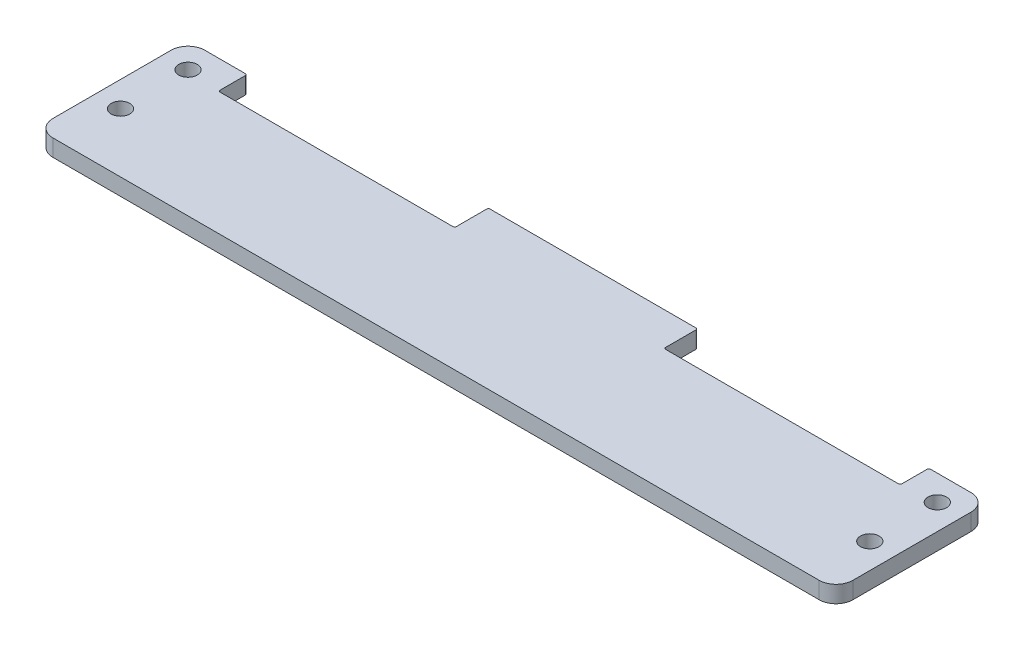
ISO-10303-21;
HEADER;
FILE_DESCRIPTION(('STEP AP214'),'2;1');
FILE_NAME('part.step','',(''),(''),'','','');
FILE_SCHEMA(('AUTOMOTIVE_DESIGN { 1 0 10303 214 1 1 1 1 }'));
ENDSEC;
DATA;
#1=APPLICATION_CONTEXT('core data for automotive mechanical design processes');
#2=APPLICATION_PROTOCOL_DEFINITION('international standard','automotive_design',2000,#1);
#3=PRODUCT_CONTEXT('',#1,'mechanical');
#4=PRODUCT('Part','Part','',(#3));
#5=PRODUCT_RELATED_PRODUCT_CATEGORY('part','',(#4));
#6=PRODUCT_DEFINITION_FORMATION('','',#4);
#7=PRODUCT_DEFINITION_CONTEXT('part definition',#1,'design');
#8=PRODUCT_DEFINITION('design','',#6,#7);
#9=PRODUCT_DEFINITION_SHAPE('','',#8);
#10=(LENGTH_UNIT() NAMED_UNIT(*) SI_UNIT(.MILLI.,.METRE.));
#11=(NAMED_UNIT(*) PLANE_ANGLE_UNIT() SI_UNIT($,.RADIAN.));
#12=(NAMED_UNIT(*) SI_UNIT($,.STERADIAN.) SOLID_ANGLE_UNIT());
#13=UNCERTAINTY_MEASURE_WITH_UNIT(LENGTH_MEASURE(1.E-05),#10,'distance_accuracy_value','');
#14=(GEOMETRIC_REPRESENTATION_CONTEXT(3) GLOBAL_UNCERTAINTY_ASSIGNED_CONTEXT((#13)) GLOBAL_UNIT_ASSIGNED_CONTEXT((#10,
#11,#12)) REPRESENTATION_CONTEXT('',''));
#15=CARTESIAN_POINT('',(0.,0.,0.));
#16=DIRECTION('',(0.,0.,1.));
#17=DIRECTION('',(1.,0.,0.));
#18=AXIS2_PLACEMENT_3D('',#15,#16,#17);
#19=CARTESIAN_POINT('',(-118.5,-5.,-45.));
#20=DIRECTION('',(-1.,0.,0.));
#21=DIRECTION('',(0.,0.,1.));
#22=AXIS2_PLACEMENT_3D('',#19,#20,#21);
#23=PLANE('',#22);
#24=DIRECTION('',(0.,0.,1.));
#25=VECTOR('',#24,1.);
#26=CARTESIAN_POINT('',(-118.5,0.,-45.));
#27=LINE('',#26,#25);
#28=CARTESIAN_POINT('',(-118.5,0.,-40.));
#29=VERTEX_POINT('',#28);
#30=CARTESIAN_POINT('',(-118.5,0.,-5.00000000000001));
#31=VERTEX_POINT('',#30);
#32=EDGE_CURVE('E418',#29,#31,#27,.T.);
#33=ORIENTED_EDGE('',*,*,#32,.F.);
#34=DIRECTION('',(0.,1.,0.));
#35=VECTOR('',#34,1.);
#36=CARTESIAN_POINT('',(-118.5,-5.,-40.));
#37=LINE('',#36,#35);
#38=CARTESIAN_POINT('',(-118.5,-5.,-40.));
#39=VERTEX_POINT('',#38);
#40=EDGE_CURVE('E223',#29,#39,#37,.F.);
#41=ORIENTED_EDGE('',*,*,#40,.T.);
#42=DIRECTION('',(0.,0.,1.));
#43=VECTOR('',#42,1.);
#44=CARTESIAN_POINT('',(-118.5,-5.,-45.));
#45=LINE('',#44,#43);
#46=CARTESIAN_POINT('',(-118.5,-5.,-5.00000000000001));
#47=VERTEX_POINT('',#46);
#48=EDGE_CURVE('E214',#39,#47,#45,.T.);
#49=ORIENTED_EDGE('',*,*,#48,.T.);
#50=DIRECTION('',(0.,1.,0.));
#51=VECTOR('',#50,1.);
#52=CARTESIAN_POINT('',(-118.5,-5.,-5.));
#53=LINE('',#52,#51);
#54=EDGE_CURVE('E225',#47,#31,#53,.T.);
#55=ORIENTED_EDGE('',*,*,#54,.T.);
#56=EDGE_LOOP('',(#33,#41,#49,#55));
#57=FACE_BOUND('',#56,.T.);
#58=ADVANCED_FACE('F39',(#57),#23,.T.);
#59=CARTESIAN_POINT('',(-101.,-5.,-45.));
#60=DIRECTION('',(0.,0.,-1.));
#61=DIRECTION('',(-1.,0.,0.));
#62=AXIS2_PLACEMENT_3D('',#59,#60,#61);
#63=PLANE('',#62);
#64=DIRECTION('',(-1.,0.,0.));
#65=VECTOR('',#64,1.);
#66=CARTESIAN_POINT('',(-101.,0.,-45.));
#67=LINE('',#66,#65);
#68=CARTESIAN_POINT('',(-101.5,0.,-45.));
#69=VERTEX_POINT('',#68);
#70=CARTESIAN_POINT('',(-113.5,0.,-45.));
#71=VERTEX_POINT('',#70);
#72=EDGE_CURVE('E201',#69,#71,#67,.T.);
#73=ORIENTED_EDGE('',*,*,#72,.F.);
#74=DIRECTION('',(0.,1.,0.));
#75=VECTOR('',#74,1.);
#76=CARTESIAN_POINT('',(-101.5,-5.,-45.));
#77=LINE('',#76,#75);
#78=CARTESIAN_POINT('',(-101.5,-5.,-45.));
#79=VERTEX_POINT('',#78);
#80=EDGE_CURVE('E356',#69,#79,#77,.F.);
#81=ORIENTED_EDGE('',*,*,#80,.T.);
#82=DIRECTION('',(-1.,0.,0.));
#83=VECTOR('',#82,1.);
#84=CARTESIAN_POINT('',(-101.,-5.,-45.));
#85=LINE('',#84,#83);
#86=CARTESIAN_POINT('',(-113.5,-5.,-45.));
#87=VERTEX_POINT('',#86);
#88=EDGE_CURVE('E230',#79,#87,#85,.T.);
#89=ORIENTED_EDGE('',*,*,#88,.T.);
#90=DIRECTION('',(0.,1.,0.));
#91=VECTOR('',#90,1.);
#92=CARTESIAN_POINT('',(-113.5,-5.,-45.));
#93=LINE('',#92,#91);
#94=EDGE_CURVE('E222',#87,#71,#93,.T.);
#95=ORIENTED_EDGE('',*,*,#94,.T.);
#96=EDGE_LOOP('',(#73,#81,#89,#95));
#97=FACE_BOUND('',#96,.T.);
#98=ADVANCED_FACE('F228',(#97),#63,.T.);
#99=CARTESIAN_POINT('',(-101.,-5.,-36.5));
#100=DIRECTION('',(1.,0.,0.));
#101=DIRECTION('',(0.,0.,-1.));
#102=AXIS2_PLACEMENT_3D('',#99,#100,#101);
#103=PLANE('',#102);
#104=DIRECTION('',(0.,0.,-1.));
#105=VECTOR('',#104,1.);
#106=CARTESIAN_POINT('',(-101.,0.,-36.5));
#107=LINE('',#106,#105);
#108=CARTESIAN_POINT('',(-101.,0.,-37.));
#109=VERTEX_POINT('',#108);
#110=CARTESIAN_POINT('',(-101.,0.,-44.5));
#111=VERTEX_POINT('',#110);
#112=EDGE_CURVE('E215',#109,#111,#107,.T.);
#113=ORIENTED_EDGE('',*,*,#112,.F.);
#114=DIRECTION('',(0.,1.,0.));
#115=VECTOR('',#114,1.);
#116=CARTESIAN_POINT('',(-101.,-5.,-37.));
#117=LINE('',#116,#115);
#118=CARTESIAN_POINT('',(-101.,-5.,-37.));
#119=VERTEX_POINT('',#118);
#120=EDGE_CURVE('E292',#109,#119,#117,.F.);
#121=ORIENTED_EDGE('',*,*,#120,.T.);
#122=DIRECTION('',(0.,0.,-1.));
#123=VECTOR('',#122,1.);
#124=CARTESIAN_POINT('',(-101.,-5.,-36.5));
#125=LINE('',#124,#123);
#126=CARTESIAN_POINT('',(-101.,-5.,-44.5));
#127=VERTEX_POINT('',#126);
#128=EDGE_CURVE('E239',#119,#127,#125,.T.);
#129=ORIENTED_EDGE('',*,*,#128,.T.);
#130=DIRECTION('',(0.,1.,0.));
#131=VECTOR('',#130,1.);
#132=CARTESIAN_POINT('',(-101.,-5.,-44.5));
#133=LINE('',#132,#131);
#134=EDGE_CURVE('E288',#127,#111,#133,.T.);
#135=ORIENTED_EDGE('',*,*,#134,.T.);
#136=EDGE_LOOP('',(#113,#121,#129,#135));
#137=FACE_BOUND('',#136,.T.);
#138=ADVANCED_FACE('F454',(#137),#103,.T.);
#139=CARTESIAN_POINT('',(-31.,-5.,-36.5));
#140=DIRECTION('',(0.,0.,-1.));
#141=DIRECTION('',(-1.,0.,0.));
#142=AXIS2_PLACEMENT_3D('',#139,#140,#141);
#143=PLANE('',#142);
#144=DIRECTION('',(-1.,0.,0.));
#145=VECTOR('',#144,1.);
#146=CARTESIAN_POINT('',(-31.,-5.,-36.5));
#147=LINE('',#146,#145);
#148=CARTESIAN_POINT('',(-31.5,-5.,-36.5));
#149=VERTEX_POINT('',#148);
#150=CARTESIAN_POINT('',(-100.5,-5.,-36.5));
#151=VERTEX_POINT('',#150);
#152=EDGE_CURVE('E400',#149,#151,#147,.T.);
#153=ORIENTED_EDGE('',*,*,#152,.T.);
#154=DIRECTION('',(0.,1.,0.));
#155=VECTOR('',#154,1.);
#156=CARTESIAN_POINT('',(-100.5,0.,-36.5));
#157=LINE('',#156,#155);
#158=CARTESIAN_POINT('',(-100.5,0.,-36.5));
#159=VERTEX_POINT('',#158);
#160=EDGE_CURVE('E284',#151,#159,#157,.T.);
#161=ORIENTED_EDGE('',*,*,#160,.T.);
#162=DIRECTION('',(-1.,0.,0.));
#163=VECTOR('',#162,1.);
#164=CARTESIAN_POINT('',(-31.,0.,-36.5));
#165=LINE('',#164,#163);
#166=CARTESIAN_POINT('',(-31.5,0.,-36.5));
#167=VERTEX_POINT('',#166);
#168=EDGE_CURVE('E379',#167,#159,#165,.T.);
#169=ORIENTED_EDGE('',*,*,#168,.F.);
#170=DIRECTION('',(0.,1.,0.));
#171=VECTOR('',#170,1.);
#172=CARTESIAN_POINT('',(-31.5,-5.,-36.5));
#173=LINE('',#172,#171);
#174=EDGE_CURVE('E281',#167,#149,#173,.F.);
#175=ORIENTED_EDGE('',*,*,#174,.T.);
#176=EDGE_LOOP('',(#153,#161,#169,#175));
#177=FACE_BOUND('',#176,.T.);
#178=ADVANCED_FACE('F387',(#177),#143,.T.);
#179=CARTESIAN_POINT('',(-31.,-5.,-46.5));
#180=DIRECTION('',(-1.,0.,0.));
#181=DIRECTION('',(0.,0.,1.));
#182=AXIS2_PLACEMENT_3D('',#179,#180,#181);
#183=PLANE('',#182);
#184=DIRECTION('',(0.,0.,1.));
#185=VECTOR('',#184,1.);
#186=CARTESIAN_POINT('',(-31.,0.,-46.5));
#187=LINE('',#186,#185);
#188=CARTESIAN_POINT('',(-31.,0.,-46.));
#189=VERTEX_POINT('',#188);
#190=CARTESIAN_POINT('',(-31.,0.,-37.));
#191=VERTEX_POINT('',#190);
#192=EDGE_CURVE('E381',#189,#191,#187,.T.);
#193=ORIENTED_EDGE('',*,*,#192,.F.);
#194=DIRECTION('',(0.,1.,0.));
#195=VECTOR('',#194,1.);
#196=CARTESIAN_POINT('',(-31.,-5.,-46.));
#197=LINE('',#196,#195);
#198=CARTESIAN_POINT('',(-31.,-5.,-46.));
#199=VERTEX_POINT('',#198);
#200=EDGE_CURVE('E353',#189,#199,#197,.F.);
#201=ORIENTED_EDGE('',*,*,#200,.T.);
#202=DIRECTION('',(0.,0.,1.));
#203=VECTOR('',#202,1.);
#204=CARTESIAN_POINT('',(-31.,-5.,-46.5));
#205=LINE('',#204,#203);
#206=CARTESIAN_POINT('',(-31.,-5.,-37.));
#207=VERTEX_POINT('',#206);
#208=EDGE_CURVE('E398',#199,#207,#205,.T.);
#209=ORIENTED_EDGE('',*,*,#208,.T.);
#210=DIRECTION('',(0.,1.,0.));
#211=VECTOR('',#210,1.);
#212=CARTESIAN_POINT('',(-31.,0.,-37.));
#213=LINE('',#212,#211);
#214=EDGE_CURVE('E349',#207,#191,#213,.T.);
#215=ORIENTED_EDGE('',*,*,#214,.T.);
#216=EDGE_LOOP('',(#193,#201,#209,#215));
#217=FACE_BOUND('',#216,.T.);
#218=ADVANCED_FACE('F402',(#217),#183,.T.);
#219=CARTESIAN_POINT('',(31.,-5.,-46.5));
#220=DIRECTION('',(0.,0.,-1.));
#221=DIRECTION('',(-1.,0.,0.));
#222=AXIS2_PLACEMENT_3D('',#219,#220,#221);
#223=PLANE('',#222);
#224=DIRECTION('',(-1.,0.,0.));
#225=VECTOR('',#224,1.);
#226=CARTESIAN_POINT('',(31.,0.,-46.5));
#227=LINE('',#226,#225);
#228=CARTESIAN_POINT('',(30.5,0.,-46.5));
#229=VERTEX_POINT('',#228);
#230=CARTESIAN_POINT('',(-30.5,0.,-46.5));
#231=VERTEX_POINT('',#230);
#232=EDGE_CURVE('E445',#229,#231,#227,.T.);
#233=ORIENTED_EDGE('',*,*,#232,.F.);
#234=DIRECTION('',(0.,1.,0.));
#235=VECTOR('',#234,1.);
#236=CARTESIAN_POINT('',(30.5,-5.,-46.5));
#237=LINE('',#236,#235);
#238=CARTESIAN_POINT('',(30.5,-5.,-46.5));
#239=VERTEX_POINT('',#238);
#240=EDGE_CURVE('E346',#229,#239,#237,.F.);
#241=ORIENTED_EDGE('',*,*,#240,.T.);
#242=DIRECTION('',(-1.,0.,0.));
#243=VECTOR('',#242,1.);
#244=CARTESIAN_POINT('',(31.,-5.,-46.5));
#245=LINE('',#244,#243);
#246=CARTESIAN_POINT('',(-30.5,-5.,-46.5));
#247=VERTEX_POINT('',#246);
#248=EDGE_CURVE('E405',#239,#247,#245,.T.);
#249=ORIENTED_EDGE('',*,*,#248,.T.);
#250=DIRECTION('',(0.,1.,0.));
#251=VECTOR('',#250,1.);
#252=CARTESIAN_POINT('',(-30.5,-5.,-46.5));
#253=LINE('',#252,#251);
#254=EDGE_CURVE('E342',#247,#231,#253,.T.);
#255=ORIENTED_EDGE('',*,*,#254,.T.);
#256=EDGE_LOOP('',(#233,#241,#249,#255));
#257=FACE_BOUND('',#256,.T.);
#258=ADVANCED_FACE('F504',(#257),#223,.T.);
#259=CARTESIAN_POINT('',(31.,-5.,-36.5));
#260=DIRECTION('',(1.,0.,0.));
#261=DIRECTION('',(0.,0.,-1.));
#262=AXIS2_PLACEMENT_3D('',#259,#260,#261);
#263=PLANE('',#262);
#264=DIRECTION('',(0.,0.,-1.));
#265=VECTOR('',#264,1.);
#266=CARTESIAN_POINT('',(31.,0.,-36.5));
#267=LINE('',#266,#265);
#268=CARTESIAN_POINT('',(31.,0.,-37.));
#269=VERTEX_POINT('',#268);
#270=CARTESIAN_POINT('',(31.,0.,-46.));
#271=VERTEX_POINT('',#270);
#272=EDGE_CURVE('E441',#269,#271,#267,.T.);
#273=ORIENTED_EDGE('',*,*,#272,.F.);
#274=DIRECTION('',(0.,1.,0.));
#275=VECTOR('',#274,1.);
#276=CARTESIAN_POINT('',(31.,-5.,-37.));
#277=LINE('',#276,#275);
#278=CARTESIAN_POINT('',(31.,-5.,-37.));
#279=VERTEX_POINT('',#278);
#280=EDGE_CURVE('E339',#269,#279,#277,.F.);
#281=ORIENTED_EDGE('',*,*,#280,.T.);
#282=DIRECTION('',(0.,0.,-1.));
#283=VECTOR('',#282,1.);
#284=CARTESIAN_POINT('',(31.,-5.,-36.5));
#285=LINE('',#284,#283);
#286=CARTESIAN_POINT('',(31.,-5.,-46.));
#287=VERTEX_POINT('',#286);
#288=EDGE_CURVE('E411',#279,#287,#285,.T.);
#289=ORIENTED_EDGE('',*,*,#288,.T.);
#290=DIRECTION('',(0.,1.,0.));
#291=VECTOR('',#290,1.);
#292=CARTESIAN_POINT('',(31.,-5.,-46.));
#293=LINE('',#292,#291);
#294=EDGE_CURVE('E335',#287,#271,#293,.T.);
#295=ORIENTED_EDGE('',*,*,#294,.T.);
#296=EDGE_LOOP('',(#273,#281,#289,#295));
#297=FACE_BOUND('',#296,.T.);
#298=ADVANCED_FACE('F496',(#297),#263,.T.);
#299=CARTESIAN_POINT('',(101.,-5.,-36.5));
#300=DIRECTION('',(0.,0.,-1.));
#301=DIRECTION('',(-1.,0.,0.));
#302=AXIS2_PLACEMENT_3D('',#299,#300,#301);
#303=PLANE('',#302);
#304=DIRECTION('',(-1.,0.,0.));
#305=VECTOR('',#304,1.);
#306=CARTESIAN_POINT('',(101.,0.,-36.5));
#307=LINE('',#306,#305);
#308=CARTESIAN_POINT('',(100.5,0.,-36.5));
#309=VERTEX_POINT('',#308);
#310=CARTESIAN_POINT('',(31.5,0.,-36.5));
#311=VERTEX_POINT('',#310);
#312=EDGE_CURVE('E437',#309,#311,#307,.T.);
#313=ORIENTED_EDGE('',*,*,#312,.F.);
#314=DIRECTION('',(0.,1.,0.));
#315=VECTOR('',#314,1.);
#316=CARTESIAN_POINT('',(100.5,-5.,-36.5));
#317=LINE('',#316,#315);
#318=CARTESIAN_POINT('',(100.5,-5.,-36.5));
#319=VERTEX_POINT('',#318);
#320=EDGE_CURVE('E62',#309,#319,#317,.F.);
#321=ORIENTED_EDGE('',*,*,#320,.T.);
#322=DIRECTION('',(-1.,0.,0.));
#323=VECTOR('',#322,1.);
#324=CARTESIAN_POINT('',(101.,-5.,-36.5));
#325=LINE('',#324,#323);
#326=CARTESIAN_POINT('',(31.5,-5.,-36.5));
#327=VERTEX_POINT('',#326);
#328=EDGE_CURVE('E489',#319,#327,#325,.T.);
#329=ORIENTED_EDGE('',*,*,#328,.T.);
#330=DIRECTION('',(0.,1.,0.));
#331=VECTOR('',#330,1.);
#332=CARTESIAN_POINT('',(31.5,0.,-36.5));
#333=LINE('',#332,#331);
#334=EDGE_CURVE('E329',#327,#311,#333,.T.);
#335=ORIENTED_EDGE('',*,*,#334,.T.);
#336=EDGE_LOOP('',(#313,#321,#329,#335));
#337=FACE_BOUND('',#336,.T.);
#338=ADVANCED_FACE('F557',(#337),#303,.T.);
#339=CARTESIAN_POINT('',(101.,-5.,-36.5));
#340=DIRECTION('',(-1.,0.,0.));
#341=DIRECTION('',(0.,0.,1.));
#342=AXIS2_PLACEMENT_3D('',#339,#340,#341);
#343=PLANE('',#342);
#344=DIRECTION('',(0.,0.,1.));
#345=VECTOR('',#344,1.);
#346=CARTESIAN_POINT('',(101.,0.,-36.5));
#347=LINE('',#346,#345);
#348=CARTESIAN_POINT('',(101.,0.,-44.5));
#349=VERTEX_POINT('',#348);
#350=CARTESIAN_POINT('',(101.,0.,-37.));
#351=VERTEX_POINT('',#350);
#352=EDGE_CURVE('E433',#349,#351,#347,.T.);
#353=ORIENTED_EDGE('',*,*,#352,.F.);
#354=DIRECTION('',(0.,1.,0.));
#355=VECTOR('',#354,1.);
#356=CARTESIAN_POINT('',(101.,-5.,-44.5));
#357=LINE('',#356,#355);
#358=CARTESIAN_POINT('',(101.,-5.,-44.5));
#359=VERTEX_POINT('',#358);
#360=EDGE_CURVE('E314',#349,#359,#357,.F.);
#361=ORIENTED_EDGE('',*,*,#360,.T.);
#362=DIRECTION('',(0.,0.,1.));
#363=VECTOR('',#362,1.);
#364=CARTESIAN_POINT('',(101.,-5.,-36.5));
#365=LINE('',#364,#363);
#366=CARTESIAN_POINT('',(101.,-5.,-37.));
#367=VERTEX_POINT('',#366);
#368=EDGE_CURVE('E485',#359,#367,#365,.T.);
#369=ORIENTED_EDGE('',*,*,#368,.T.);
#370=DIRECTION('',(0.,1.,0.));
#371=VECTOR('',#370,1.);
#372=CARTESIAN_POINT('',(101.,0.,-37.));
#373=LINE('',#372,#371);
#374=EDGE_CURVE('E310',#367,#351,#373,.T.);
#375=ORIENTED_EDGE('',*,*,#374,.T.);
#376=EDGE_LOOP('',(#353,#361,#369,#375));
#377=FACE_BOUND('',#376,.T.);
#378=ADVANCED_FACE('F562',(#377),#343,.T.);
#379=CARTESIAN_POINT('',(101.,-5.,-45.));
#380=DIRECTION('',(0.,0.,-1.));
#381=DIRECTION('',(-1.,0.,0.));
#382=AXIS2_PLACEMENT_3D('',#379,#380,#381);
#383=PLANE('',#382);
#384=DIRECTION('',(-1.,0.,0.));
#385=VECTOR('',#384,1.);
#386=CARTESIAN_POINT('',(101.,-5.,-45.));
#387=LINE('',#386,#385);
#388=CARTESIAN_POINT('',(113.5,-5.,-45.));
#389=VERTEX_POINT('',#388);
#390=CARTESIAN_POINT('',(101.5,-5.,-45.));
#391=VERTEX_POINT('',#390);
#392=EDGE_CURVE('E481',#389,#391,#387,.T.);
#393=ORIENTED_EDGE('',*,*,#392,.T.);
#394=DIRECTION('',(0.,1.,0.));
#395=VECTOR('',#394,1.);
#396=CARTESIAN_POINT('',(101.5,-5.,-45.));
#397=LINE('',#396,#395);
#398=CARTESIAN_POINT('',(101.5,0.,-45.));
#399=VERTEX_POINT('',#398);
#400=EDGE_CURVE('E295',#391,#399,#397,.T.);
#401=ORIENTED_EDGE('',*,*,#400,.T.);
#402=DIRECTION('',(-1.,0.,0.));
#403=VECTOR('',#402,1.);
#404=CARTESIAN_POINT('',(101.,0.,-45.));
#405=LINE('',#404,#403);
#406=CARTESIAN_POINT('',(113.5,0.,-45.));
#407=VERTEX_POINT('',#406);
#408=EDGE_CURVE('E430',#407,#399,#405,.T.);
#409=ORIENTED_EDGE('',*,*,#408,.F.);
#410=DIRECTION('',(0.,1.,0.));
#411=VECTOR('',#410,1.);
#412=CARTESIAN_POINT('',(113.5,-5.,-45.));
#413=LINE('',#412,#411);
#414=EDGE_CURVE('E271',#407,#389,#413,.F.);
#415=ORIENTED_EDGE('',*,*,#414,.T.);
#416=EDGE_LOOP('',(#393,#401,#409,#415));
#417=FACE_BOUND('',#416,.T.);
#418=ADVANCED_FACE('F569',(#417),#383,.T.);
#419=CARTESIAN_POINT('',(118.5,-5.,0.));
#420=DIRECTION('',(1.,0.,0.));
#421=DIRECTION('',(0.,0.,-1.));
#422=AXIS2_PLACEMENT_3D('',#419,#420,#421);
#423=PLANE('',#422);
#424=DIRECTION('',(0.,0.,-1.));
#425=VECTOR('',#424,1.);
#426=CARTESIAN_POINT('',(118.5,-5.,0.));
#427=LINE('',#426,#425);
#428=CARTESIAN_POINT('',(118.5,-5.,-5.));
#429=VERTEX_POINT('',#428);
#430=CARTESIAN_POINT('',(118.5,-5.,-40.));
#431=VERTEX_POINT('',#430);
#432=EDGE_CURVE('E473',#429,#431,#427,.T.);
#433=ORIENTED_EDGE('',*,*,#432,.T.);
#434=DIRECTION('',(0.,1.,0.));
#435=VECTOR('',#434,1.);
#436=CARTESIAN_POINT('',(118.5,-5.,-40.));
#437=LINE('',#436,#435);
#438=CARTESIAN_POINT('',(118.5,0.,-40.));
#439=VERTEX_POINT('',#438);
#440=EDGE_CURVE('E267',#431,#439,#437,.T.);
#441=ORIENTED_EDGE('',*,*,#440,.T.);
#442=DIRECTION('',(0.,0.,-1.));
#443=VECTOR('',#442,1.);
#444=CARTESIAN_POINT('',(118.5,0.,0.));
#445=LINE('',#444,#443);
#446=CARTESIAN_POINT('',(118.5,0.,-5.));
#447=VERTEX_POINT('',#446);
#448=EDGE_CURVE('E426',#447,#439,#445,.T.);
#449=ORIENTED_EDGE('',*,*,#448,.F.);
#450=DIRECTION('',(0.,1.,0.));
#451=VECTOR('',#450,1.);
#452=CARTESIAN_POINT('',(118.5,-5.,-5.));
#453=LINE('',#452,#451);
#454=EDGE_CURVE('E264',#447,#429,#453,.F.);
#455=ORIENTED_EDGE('',*,*,#454,.T.);
#456=EDGE_LOOP('',(#433,#441,#449,#455));
#457=FACE_BOUND('',#456,.T.);
#458=ADVANCED_FACE('F575',(#457),#423,.T.);
#459=CARTESIAN_POINT('',(-118.5,-5.,0.));
#460=DIRECTION('',(0.,0.,1.));
#461=DIRECTION('',(1.,0.,0.));
#462=AXIS2_PLACEMENT_3D('',#459,#460,#461);
#463=PLANE('',#462);
#464=DIRECTION('',(1.,0.,0.));
#465=VECTOR('',#464,1.);
#466=CARTESIAN_POINT('',(-118.5,-5.,0.));
#467=LINE('',#466,#465);
#468=CARTESIAN_POINT('',(-113.5,-5.,0.));
#469=VERTEX_POINT('',#468);
#470=CARTESIAN_POINT('',(113.5,-5.,0.));
#471=VERTEX_POINT('',#470);
#472=EDGE_CURVE('E469',#469,#471,#467,.T.);
#473=ORIENTED_EDGE('',*,*,#472,.T.);
#474=DIRECTION('',(0.,1.,0.));
#475=VECTOR('',#474,1.);
#476=CARTESIAN_POINT('',(113.5,-5.,0.));
#477=LINE('',#476,#475);
#478=CARTESIAN_POINT('',(113.5,0.,0.));
#479=VERTEX_POINT('',#478);
#480=EDGE_CURVE('E277',#471,#479,#477,.T.);
#481=ORIENTED_EDGE('',*,*,#480,.T.);
#482=DIRECTION('',(1.,0.,0.));
#483=VECTOR('',#482,1.);
#484=CARTESIAN_POINT('',(-118.5,0.,0.));
#485=LINE('',#484,#483);
#486=CARTESIAN_POINT('',(-113.5,0.,0.));
#487=VERTEX_POINT('',#486);
#488=EDGE_CURVE('E421',#487,#479,#485,.T.);
#489=ORIENTED_EDGE('',*,*,#488,.F.);
#490=DIRECTION('',(0.,1.,0.));
#491=VECTOR('',#490,1.);
#492=CARTESIAN_POINT('',(-113.5,-5.,0.));
#493=LINE('',#492,#491);
#494=EDGE_CURVE('E274',#487,#469,#493,.F.);
#495=ORIENTED_EDGE('',*,*,#494,.T.);
#496=EDGE_LOOP('',(#473,#481,#489,#495));
#497=FACE_BOUND('',#496,.T.);
#498=ADVANCED_FACE('F525',(#497),#463,.T.);
#499=CARTESIAN_POINT('',(0.,-5.,0.));
#500=DIRECTION('',(0.,1.,0.));
#501=DIRECTION('',(0.,0.,1.));
#502=AXIS2_PLACEMENT_3D('',#499,#500,#501);
#503=PLANE('',#502);
#504=CARTESIAN_POINT('',(-111.,-5.,-37.5));
#505=DIRECTION('',(0.,1.,0.));
#506=DIRECTION('',(0.,0.,1.));
#507=AXIS2_PLACEMENT_3D('',#504,#505,#506);
#508=CIRCLE('',#507,2.75);
#509=CARTESIAN_POINT('',(-111.,-5.,-34.75));
#510=VERTEX_POINT('',#509);
#511=EDGE_CURVE('E631',#510,#510,#508,.T.);
#512=ORIENTED_EDGE('',*,*,#511,.T.);
#513=EDGE_LOOP('',(#512));
#514=FACE_BOUND('',#513,.T.);
#515=CARTESIAN_POINT('',(-111.,-5.,-17.5));
#516=DIRECTION('',(0.,1.,0.));
#517=DIRECTION('',(0.,0.,1.));
#518=AXIS2_PLACEMENT_3D('',#515,#516,#517);
#519=CIRCLE('',#518,2.75);
#520=CARTESIAN_POINT('',(-111.,-5.,-14.75));
#521=VERTEX_POINT('',#520);
#522=EDGE_CURVE('E644',#521,#521,#519,.T.);
#523=ORIENTED_EDGE('',*,*,#522,.T.);
#524=EDGE_LOOP('',(#523));
#525=FACE_BOUND('',#524,.T.);
#526=CARTESIAN_POINT('',(111.,-5.,-37.5));
#527=DIRECTION('',(0.,1.,0.));
#528=DIRECTION('',(0.,0.,1.));
#529=AXIS2_PLACEMENT_3D('',#526,#527,#528);
#530=CIRCLE('',#529,2.75);
#531=CARTESIAN_POINT('',(111.,-5.,-34.75));
#532=VERTEX_POINT('',#531);
#533=EDGE_CURVE('E652',#532,#532,#530,.T.);
#534=ORIENTED_EDGE('',*,*,#533,.T.);
#535=EDGE_LOOP('',(#534));
#536=FACE_BOUND('',#535,.T.);
#537=CARTESIAN_POINT('',(111.,-5.,-17.5));
#538=DIRECTION('',(0.,1.,0.));
#539=DIRECTION('',(0.,0.,1.));
#540=AXIS2_PLACEMENT_3D('',#537,#538,#539);
#541=CIRCLE('',#540,2.75);
#542=CARTESIAN_POINT('',(111.,-5.,-14.75));
#543=VERTEX_POINT('',#542);
#544=EDGE_CURVE('E422',#543,#543,#541,.T.);
#545=ORIENTED_EDGE('',*,*,#544,.T.);
#546=EDGE_LOOP('',(#545));
#547=FACE_BOUND('',#546,.T.);
#548=ORIENTED_EDGE('',*,*,#368,.F.);
#549=CARTESIAN_POINT('',(101.5,-5.,-44.5));
#550=DIRECTION('',(0.,1.,0.));
#551=DIRECTION('',(0.,0.,1.));
#552=AXIS2_PLACEMENT_3D('',#549,#550,#551);
#553=CIRCLE('',#552,0.5);
#554=EDGE_CURVE('E326',#359,#391,#553,.F.);
#555=ORIENTED_EDGE('',*,*,#554,.T.);
#556=ORIENTED_EDGE('',*,*,#392,.F.);
#557=CARTESIAN_POINT('',(113.5,-5.,-40.));
#558=DIRECTION('',(0.,1.,0.));
#559=DIRECTION('',(0.,0.,1.));
#560=AXIS2_PLACEMENT_3D('',#557,#558,#559);
#561=CIRCLE('',#560,5.);
#562=EDGE_CURVE('E258',#389,#431,#561,.F.);
#563=ORIENTED_EDGE('',*,*,#562,.T.);
#564=ORIENTED_EDGE('',*,*,#432,.F.);
#565=CARTESIAN_POINT('',(113.5,-5.,-5.));
#566=DIRECTION('',(0.,1.,0.));
#567=DIRECTION('',(0.,0.,1.));
#568=AXIS2_PLACEMENT_3D('',#565,#566,#567);
#569=CIRCLE('',#568,5.);
#570=EDGE_CURVE('E255',#429,#471,#569,.F.);
#571=ORIENTED_EDGE('',*,*,#570,.T.);
#572=ORIENTED_EDGE('',*,*,#472,.F.);
#573=CARTESIAN_POINT('',(-113.5,-5.,-5.));
#574=DIRECTION('',(0.,1.,0.));
#575=DIRECTION('',(0.,0.,1.));
#576=AXIS2_PLACEMENT_3D('',#573,#574,#575);
#577=CIRCLE('',#576,5.);
#578=EDGE_CURVE('E252',#469,#47,#577,.F.);
#579=ORIENTED_EDGE('',*,*,#578,.T.);
#580=ORIENTED_EDGE('',*,*,#48,.F.);
#581=CARTESIAN_POINT('',(-113.5,-5.,-40.));
#582=DIRECTION('',(0.,1.,0.));
#583=DIRECTION('',(0.,0.,1.));
#584=AXIS2_PLACEMENT_3D('',#581,#582,#583);
#585=CIRCLE('',#584,5.);
#586=EDGE_CURVE('E261',#39,#87,#585,.F.);
#587=ORIENTED_EDGE('',*,*,#586,.T.);
#588=ORIENTED_EDGE('',*,*,#88,.F.);
#589=CARTESIAN_POINT('',(-101.5,-5.,-44.5));
#590=DIRECTION('',(0.,1.,0.));
#591=DIRECTION('',(0.,0.,1.));
#592=AXIS2_PLACEMENT_3D('',#589,#590,#591);
#593=CIRCLE('',#592,0.5);
#594=EDGE_CURVE('E317',#79,#127,#593,.F.);
#595=ORIENTED_EDGE('',*,*,#594,.T.);
#596=ORIENTED_EDGE('',*,*,#128,.F.);
#597=CARTESIAN_POINT('',(-100.5,-5.,-37.));
#598=DIRECTION('',(0.,1.,0.));
#599=DIRECTION('',(0.,0.,1.));
#600=AXIS2_PLACEMENT_3D('',#597,#598,#599);
#601=CIRCLE('',#600,0.5);
#602=EDGE_CURVE('E362',#119,#151,#601,.T.);
#603=ORIENTED_EDGE('',*,*,#602,.T.);
#604=ORIENTED_EDGE('',*,*,#152,.F.);
#605=CARTESIAN_POINT('',(-31.5,-5.,-37.));
#606=DIRECTION('',(0.,1.,0.));
#607=DIRECTION('',(0.,0.,1.));
#608=AXIS2_PLACEMENT_3D('',#605,#606,#607);
#609=CIRCLE('',#608,0.5);
#610=EDGE_CURVE('E11',#149,#207,#609,.T.);
#611=ORIENTED_EDGE('',*,*,#610,.T.);
#612=ORIENTED_EDGE('',*,*,#208,.F.);
#613=CARTESIAN_POINT('',(-30.5,-5.,-46.));
#614=DIRECTION('',(0.,1.,0.));
#615=DIRECTION('',(0.,0.,1.));
#616=AXIS2_PLACEMENT_3D('',#613,#614,#615);
#617=CIRCLE('',#616,0.5);
#618=EDGE_CURVE('E320',#199,#247,#617,.F.);
#619=ORIENTED_EDGE('',*,*,#618,.T.);
#620=ORIENTED_EDGE('',*,*,#248,.F.);
#621=CARTESIAN_POINT('',(30.5,-5.,-46.));
#622=DIRECTION('',(0.,1.,0.));
#623=DIRECTION('',(0.,0.,1.));
#624=AXIS2_PLACEMENT_3D('',#621,#622,#623);
#625=CIRCLE('',#624,0.5);
#626=EDGE_CURVE('E323',#239,#287,#625,.F.);
#627=ORIENTED_EDGE('',*,*,#626,.T.);
#628=ORIENTED_EDGE('',*,*,#288,.F.);
#629=CARTESIAN_POINT('',(31.5,-5.,-37.));
#630=DIRECTION('',(0.,1.,0.));
#631=DIRECTION('',(0.,0.,1.));
#632=AXIS2_PLACEMENT_3D('',#629,#630,#631);
#633=CIRCLE('',#632,0.5);
#634=EDGE_CURVE('E55',#279,#327,#633,.T.);
#635=ORIENTED_EDGE('',*,*,#634,.T.);
#636=ORIENTED_EDGE('',*,*,#328,.F.);
#637=CARTESIAN_POINT('',(100.5,-5.,-37.));
#638=DIRECTION('',(0.,1.,0.));
#639=DIRECTION('',(0.,0.,1.));
#640=AXIS2_PLACEMENT_3D('',#637,#638,#639);
#641=CIRCLE('',#640,0.5);
#642=EDGE_CURVE('E368',#319,#367,#641,.T.);
#643=ORIENTED_EDGE('',*,*,#642,.T.);
#644=EDGE_LOOP('',(#548,#555,#556,#563,#564,#571,#572,#579,#580,#587,#588,#595,#596,#603,#604,
#611,#612,#619,#620,#627,#628,#635,#636,#643));
#645=FACE_BOUND('',#644,.T.);
#646=ADVANCED_FACE('F397',(#514,#525,#536,#547,#645),#503,.F.);
#647=CARTESIAN_POINT('',(0.,0.,0.));
#648=DIRECTION('',(0.,1.,0.));
#649=DIRECTION('',(0.,0.,1.));
#650=AXIS2_PLACEMENT_3D('',#647,#648,#649);
#651=PLANE('',#650);
#652=CARTESIAN_POINT('',(-111.,0.,-37.5));
#653=DIRECTION('',(0.,1.,0.));
#654=DIRECTION('',(0.,0.,1.));
#655=AXIS2_PLACEMENT_3D('',#652,#653,#654);
#656=CIRCLE('',#655,2.75);
#657=CARTESIAN_POINT('',(-111.,0.,-34.75));
#658=VERTEX_POINT('',#657);
#659=EDGE_CURVE('E634',#658,#658,#656,.T.);
#660=ORIENTED_EDGE('',*,*,#659,.F.);
#661=EDGE_LOOP('',(#660));
#662=FACE_BOUND('',#661,.T.);
#663=CARTESIAN_POINT('',(-111.,0.,-17.5));
#664=DIRECTION('',(0.,1.,0.));
#665=DIRECTION('',(0.,0.,1.));
#666=AXIS2_PLACEMENT_3D('',#663,#664,#665);
#667=CIRCLE('',#666,2.75);
#668=CARTESIAN_POINT('',(-111.,0.,-14.75));
#669=VERTEX_POINT('',#668);
#670=EDGE_CURVE('E638',#669,#669,#667,.T.);
#671=ORIENTED_EDGE('',*,*,#670,.F.);
#672=EDGE_LOOP('',(#671));
#673=FACE_BOUND('',#672,.T.);
#674=CARTESIAN_POINT('',(111.,0.,-37.5));
#675=DIRECTION('',(0.,1.,0.));
#676=DIRECTION('',(0.,0.,1.));
#677=AXIS2_PLACEMENT_3D('',#674,#675,#676);
#678=CIRCLE('',#677,2.75);
#679=CARTESIAN_POINT('',(111.,0.,-34.75));
#680=VERTEX_POINT('',#679);
#681=EDGE_CURVE('E648',#680,#680,#678,.T.);
#682=ORIENTED_EDGE('',*,*,#681,.F.);
#683=EDGE_LOOP('',(#682));
#684=FACE_BOUND('',#683,.T.);
#685=CARTESIAN_POINT('',(111.,0.,-17.5));
#686=DIRECTION('',(0.,1.,0.));
#687=DIRECTION('',(0.,0.,1.));
#688=AXIS2_PLACEMENT_3D('',#685,#686,#687);
#689=CIRCLE('',#688,2.75);
#690=CARTESIAN_POINT('',(111.,0.,-14.75));
#691=VERTEX_POINT('',#690);
#692=EDGE_CURVE('E655',#691,#691,#689,.T.);
#693=ORIENTED_EDGE('',*,*,#692,.F.);
#694=EDGE_LOOP('',(#693));
#695=FACE_BOUND('',#694,.T.);
#696=ORIENTED_EDGE('',*,*,#408,.T.);
#697=CARTESIAN_POINT('',(101.5,0.,-44.5));
#698=DIRECTION('',(0.,1.,0.));
#699=DIRECTION('',(0.,0.,1.));
#700=AXIS2_PLACEMENT_3D('',#697,#698,#699);
#701=CIRCLE('',#700,0.5);
#702=EDGE_CURVE('E307',#399,#349,#701,.T.);
#703=ORIENTED_EDGE('',*,*,#702,.T.);
#704=ORIENTED_EDGE('',*,*,#352,.T.);
#705=CARTESIAN_POINT('',(100.5,0.,-37.));
#706=DIRECTION('',(0.,1.,0.));
#707=DIRECTION('',(0.,0.,1.));
#708=AXIS2_PLACEMENT_3D('',#705,#706,#707);
#709=CIRCLE('',#708,0.5);
#710=EDGE_CURVE('E365',#351,#309,#709,.F.);
#711=ORIENTED_EDGE('',*,*,#710,.T.);
#712=ORIENTED_EDGE('',*,*,#312,.T.);
#713=CARTESIAN_POINT('',(31.5,0.,-37.));
#714=DIRECTION('',(0.,1.,0.));
#715=DIRECTION('',(0.,0.,1.));
#716=AXIS2_PLACEMENT_3D('',#713,#714,#715);
#717=CIRCLE('',#716,0.5);
#718=EDGE_CURVE('E371',#311,#269,#717,.F.);
#719=ORIENTED_EDGE('',*,*,#718,.T.);
#720=ORIENTED_EDGE('',*,*,#272,.T.);
#721=CARTESIAN_POINT('',(30.5,0.,-46.));
#722=DIRECTION('',(0.,1.,0.));
#723=DIRECTION('',(0.,0.,1.));
#724=AXIS2_PLACEMENT_3D('',#721,#722,#723);
#725=CIRCLE('',#724,0.5);
#726=EDGE_CURVE('E304',#271,#229,#725,.T.);
#727=ORIENTED_EDGE('',*,*,#726,.T.);
#728=ORIENTED_EDGE('',*,*,#232,.T.);
#729=CARTESIAN_POINT('',(-30.5,0.,-46.));
#730=DIRECTION('',(0.,1.,0.));
#731=DIRECTION('',(0.,0.,1.));
#732=AXIS2_PLACEMENT_3D('',#729,#730,#731);
#733=CIRCLE('',#732,0.5);
#734=EDGE_CURVE('E301',#231,#189,#733,.T.);
#735=ORIENTED_EDGE('',*,*,#734,.T.);
#736=ORIENTED_EDGE('',*,*,#192,.T.);
#737=CARTESIAN_POINT('',(-31.5,0.,-37.));
#738=DIRECTION('',(0.,1.,0.));
#739=DIRECTION('',(0.,0.,1.));
#740=AXIS2_PLACEMENT_3D('',#737,#738,#739);
#741=CIRCLE('',#740,0.5);
#742=EDGE_CURVE('E48',#191,#167,#741,.F.);
#743=ORIENTED_EDGE('',*,*,#742,.T.);
#744=ORIENTED_EDGE('',*,*,#168,.T.);
#745=CARTESIAN_POINT('',(-100.5,0.,-37.));
#746=DIRECTION('',(0.,1.,0.));
#747=DIRECTION('',(0.,0.,1.));
#748=AXIS2_PLACEMENT_3D('',#745,#746,#747);
#749=CIRCLE('',#748,0.5);
#750=EDGE_CURVE('E359',#159,#109,#749,.F.);
#751=ORIENTED_EDGE('',*,*,#750,.T.);
#752=ORIENTED_EDGE('',*,*,#112,.T.);
#753=CARTESIAN_POINT('',(-101.5,0.,-44.5));
#754=DIRECTION('',(0.,1.,0.));
#755=DIRECTION('',(0.,0.,1.));
#756=AXIS2_PLACEMENT_3D('',#753,#754,#755);
#757=CIRCLE('',#756,0.5);
#758=EDGE_CURVE('E209',#111,#69,#757,.T.);
#759=ORIENTED_EDGE('',*,*,#758,.T.);
#760=ORIENTED_EDGE('',*,*,#72,.T.);
#761=CARTESIAN_POINT('',(-113.5,0.,-40.));
#762=DIRECTION('',(0.,1.,0.));
#763=DIRECTION('',(0.,0.,1.));
#764=AXIS2_PLACEMENT_3D('',#761,#762,#763);
#765=CIRCLE('',#764,5.);
#766=EDGE_CURVE('E206',#71,#29,#765,.T.);
#767=ORIENTED_EDGE('',*,*,#766,.T.);
#768=ORIENTED_EDGE('',*,*,#32,.T.);
#769=CARTESIAN_POINT('',(-113.5,0.,-5.));
#770=DIRECTION('',(0.,1.,0.));
#771=DIRECTION('',(0.,0.,1.));
#772=AXIS2_PLACEMENT_3D('',#769,#770,#771);
#773=CIRCLE('',#772,5.);
#774=EDGE_CURVE('E233',#31,#487,#773,.T.);
#775=ORIENTED_EDGE('',*,*,#774,.T.);
#776=ORIENTED_EDGE('',*,*,#488,.T.);
#777=CARTESIAN_POINT('',(113.5,0.,-5.));
#778=DIRECTION('',(0.,1.,0.));
#779=DIRECTION('',(0.,0.,1.));
#780=AXIS2_PLACEMENT_3D('',#777,#778,#779);
#781=CIRCLE('',#780,5.);
#782=EDGE_CURVE('E237',#479,#447,#781,.T.);
#783=ORIENTED_EDGE('',*,*,#782,.T.);
#784=ORIENTED_EDGE('',*,*,#448,.T.);
#785=CARTESIAN_POINT('',(113.5,0.,-40.));
#786=DIRECTION('',(0.,1.,0.));
#787=DIRECTION('',(0.,0.,1.));
#788=AXIS2_PLACEMENT_3D('',#785,#786,#787);
#789=CIRCLE('',#788,5.);
#790=EDGE_CURVE('E226',#439,#407,#789,.T.);
#791=ORIENTED_EDGE('',*,*,#790,.T.);
#792=EDGE_LOOP('',(#696,#703,#704,#711,#712,#719,#720,#727,#728,#735,#736,#743,#744,#751,#752,
#759,#760,#767,#768,#775,#776,#783,#784,#791));
#793=FACE_BOUND('',#792,.T.);
#794=ADVANCED_FACE('F204',(#662,#673,#684,#695,#793),#651,.T.);
#795=CARTESIAN_POINT('',(111.,0.,-17.5));
#796=DIRECTION('',(0.,1.,0.));
#797=DIRECTION('',(0.,0.,1.));
#798=AXIS2_PLACEMENT_3D('',#795,#796,#797);
#799=CYLINDRICAL_SURFACE('',#798,2.75);
#800=ORIENTED_EDGE('',*,*,#544,.F.);
#801=EDGE_LOOP('',(#800));
#802=FACE_BOUND('',#801,.T.);
#803=ORIENTED_EDGE('',*,*,#692,.T.);
#804=EDGE_LOOP('',(#803));
#805=FACE_BOUND('',#804,.T.);
#806=ADVANCED_FACE('F610',(#802,#805),#799,.F.);
#807=CARTESIAN_POINT('',(111.,0.,-37.5));
#808=DIRECTION('',(0.,1.,0.));
#809=DIRECTION('',(0.,0.,1.));
#810=AXIS2_PLACEMENT_3D('',#807,#808,#809);
#811=CYLINDRICAL_SURFACE('',#810,2.75);
#812=ORIENTED_EDGE('',*,*,#533,.F.);
#813=EDGE_LOOP('',(#812));
#814=FACE_BOUND('',#813,.T.);
#815=ORIENTED_EDGE('',*,*,#681,.T.);
#816=EDGE_LOOP('',(#815));
#817=FACE_BOUND('',#816,.T.);
#818=ADVANCED_FACE('F615',(#814,#817),#811,.F.);
#819=CARTESIAN_POINT('',(-111.,0.,-17.5));
#820=DIRECTION('',(0.,1.,0.));
#821=DIRECTION('',(0.,0.,1.));
#822=AXIS2_PLACEMENT_3D('',#819,#820,#821);
#823=CYLINDRICAL_SURFACE('',#822,2.75);
#824=ORIENTED_EDGE('',*,*,#522,.F.);
#825=EDGE_LOOP('',(#824));
#826=FACE_BOUND('',#825,.T.);
#827=ORIENTED_EDGE('',*,*,#670,.T.);
#828=EDGE_LOOP('',(#827));
#829=FACE_BOUND('',#828,.T.);
#830=ADVANCED_FACE('F619',(#826,#829),#823,.F.);
#831=CARTESIAN_POINT('',(-111.,0.,-37.5));
#832=DIRECTION('',(0.,1.,0.));
#833=DIRECTION('',(0.,0.,1.));
#834=AXIS2_PLACEMENT_3D('',#831,#832,#833);
#835=CYLINDRICAL_SURFACE('',#834,2.75);
#836=ORIENTED_EDGE('',*,*,#511,.F.);
#837=EDGE_LOOP('',(#836));
#838=FACE_BOUND('',#837,.T.);
#839=ORIENTED_EDGE('',*,*,#659,.T.);
#840=EDGE_LOOP('',(#839));
#841=FACE_BOUND('',#840,.T.);
#842=ADVANCED_FACE('F530',(#838,#841),#835,.F.);
#843=CARTESIAN_POINT('',(-113.5,-5.,-40.));
#844=DIRECTION('',(0.,1.,0.));
#845=DIRECTION('',(0.,0.,1.));
#846=AXIS2_PLACEMENT_3D('',#843,#844,#845);
#847=CYLINDRICAL_SURFACE('',#846,5.);
#848=ORIENTED_EDGE('',*,*,#586,.F.);
#849=ORIENTED_EDGE('',*,*,#40,.F.);
#850=ORIENTED_EDGE('',*,*,#766,.F.);
#851=ORIENTED_EDGE('',*,*,#94,.F.);
#852=EDGE_LOOP('',(#848,#849,#850,#851));
#853=FACE_BOUND('',#852,.T.);
#854=ADVANCED_FACE('F221',(#853),#847,.T.);
#855=CARTESIAN_POINT('',(113.5,-5.,-40.));
#856=DIRECTION('',(0.,1.,0.));
#857=DIRECTION('',(0.,0.,1.));
#858=AXIS2_PLACEMENT_3D('',#855,#856,#857);
#859=CYLINDRICAL_SURFACE('',#858,5.);
#860=ORIENTED_EDGE('',*,*,#562,.F.);
#861=ORIENTED_EDGE('',*,*,#414,.F.);
#862=ORIENTED_EDGE('',*,*,#790,.F.);
#863=ORIENTED_EDGE('',*,*,#440,.F.);
#864=EDGE_LOOP('',(#860,#861,#862,#863));
#865=FACE_BOUND('',#864,.T.);
#866=ADVANCED_FACE('F529',(#865),#859,.T.);
#867=CARTESIAN_POINT('',(113.5,-5.,-5.));
#868=DIRECTION('',(0.,1.,0.));
#869=DIRECTION('',(0.,0.,1.));
#870=AXIS2_PLACEMENT_3D('',#867,#868,#869);
#871=CYLINDRICAL_SURFACE('',#870,5.);
#872=ORIENTED_EDGE('',*,*,#570,.F.);
#873=ORIENTED_EDGE('',*,*,#454,.F.);
#874=ORIENTED_EDGE('',*,*,#782,.F.);
#875=ORIENTED_EDGE('',*,*,#480,.F.);
#876=EDGE_LOOP('',(#872,#873,#874,#875));
#877=FACE_BOUND('',#876,.T.);
#878=ADVANCED_FACE('F533',(#877),#871,.T.);
#879=CARTESIAN_POINT('',(-113.5,-5.,-5.));
#880=DIRECTION('',(0.,1.,0.));
#881=DIRECTION('',(0.,0.,1.));
#882=AXIS2_PLACEMENT_3D('',#879,#880,#881);
#883=CYLINDRICAL_SURFACE('',#882,5.);
#884=ORIENTED_EDGE('',*,*,#578,.F.);
#885=ORIENTED_EDGE('',*,*,#494,.F.);
#886=ORIENTED_EDGE('',*,*,#774,.F.);
#887=ORIENTED_EDGE('',*,*,#54,.F.);
#888=EDGE_LOOP('',(#884,#885,#886,#887));
#889=FACE_BOUND('',#888,.T.);
#890=ADVANCED_FACE('F537',(#889),#883,.T.);
#891=CARTESIAN_POINT('',(-100.5,-5.,-37.));
#892=DIRECTION('',(0.,-1.,0.));
#893=DIRECTION('',(0.,0.,-1.));
#894=AXIS2_PLACEMENT_3D('',#891,#892,#893);
#895=CYLINDRICAL_SURFACE('',#894,0.5);
#896=ORIENTED_EDGE('',*,*,#602,.F.);
#897=ORIENTED_EDGE('',*,*,#120,.F.);
#898=ORIENTED_EDGE('',*,*,#750,.F.);
#899=ORIENTED_EDGE('',*,*,#160,.F.);
#900=EDGE_LOOP('',(#896,#897,#898,#899));
#901=FACE_BOUND('',#900,.T.);
#902=ADVANCED_FACE('F459',(#901),#895,.F.);
#903=CARTESIAN_POINT('',(101.5,-5.,-44.5));
#904=DIRECTION('',(0.,1.,0.));
#905=DIRECTION('',(0.,0.,1.));
#906=AXIS2_PLACEMENT_3D('',#903,#904,#905);
#907=CYLINDRICAL_SURFACE('',#906,0.5);
#908=ORIENTED_EDGE('',*,*,#554,.F.);
#909=ORIENTED_EDGE('',*,*,#360,.F.);
#910=ORIENTED_EDGE('',*,*,#702,.F.);
#911=ORIENTED_EDGE('',*,*,#400,.F.);
#912=EDGE_LOOP('',(#908,#909,#910,#911));
#913=FACE_BOUND('',#912,.T.);
#914=ADVANCED_FACE('F544',(#913),#907,.T.);
#915=CARTESIAN_POINT('',(100.5,-5.,-37.));
#916=DIRECTION('',(0.,-1.,0.));
#917=DIRECTION('',(0.,0.,-1.));
#918=AXIS2_PLACEMENT_3D('',#915,#916,#917);
#919=CYLINDRICAL_SURFACE('',#918,0.5);
#920=ORIENTED_EDGE('',*,*,#642,.F.);
#921=ORIENTED_EDGE('',*,*,#320,.F.);
#922=ORIENTED_EDGE('',*,*,#710,.F.);
#923=ORIENTED_EDGE('',*,*,#374,.F.);
#924=EDGE_LOOP('',(#920,#921,#922,#923));
#925=FACE_BOUND('',#924,.T.);
#926=ADVANCED_FACE('F547',(#925),#919,.F.);
#927=CARTESIAN_POINT('',(31.5,-5.,-37.));
#928=DIRECTION('',(0.,-1.,0.));
#929=DIRECTION('',(0.,0.,-1.));
#930=AXIS2_PLACEMENT_3D('',#927,#928,#929);
#931=CYLINDRICAL_SURFACE('',#930,0.5);
#932=ORIENTED_EDGE('',*,*,#634,.F.);
#933=ORIENTED_EDGE('',*,*,#280,.F.);
#934=ORIENTED_EDGE('',*,*,#718,.F.);
#935=ORIENTED_EDGE('',*,*,#334,.F.);
#936=EDGE_LOOP('',(#932,#933,#934,#935));
#937=FACE_BOUND('',#936,.T.);
#938=ADVANCED_FACE('F515',(#937),#931,.F.);
#939=CARTESIAN_POINT('',(30.5,-5.,-46.));
#940=DIRECTION('',(0.,1.,0.));
#941=DIRECTION('',(0.,0.,1.));
#942=AXIS2_PLACEMENT_3D('',#939,#940,#941);
#943=CYLINDRICAL_SURFACE('',#942,0.5);
#944=ORIENTED_EDGE('',*,*,#626,.F.);
#945=ORIENTED_EDGE('',*,*,#240,.F.);
#946=ORIENTED_EDGE('',*,*,#726,.F.);
#947=ORIENTED_EDGE('',*,*,#294,.F.);
#948=EDGE_LOOP('',(#944,#945,#946,#947));
#949=FACE_BOUND('',#948,.T.);
#950=ADVANCED_FACE('F500',(#949),#943,.T.);
#951=CARTESIAN_POINT('',(-30.5,-5.,-46.));
#952=DIRECTION('',(0.,1.,0.));
#953=DIRECTION('',(0.,0.,1.));
#954=AXIS2_PLACEMENT_3D('',#951,#952,#953);
#955=CYLINDRICAL_SURFACE('',#954,0.5);
#956=ORIENTED_EDGE('',*,*,#618,.F.);
#957=ORIENTED_EDGE('',*,*,#200,.F.);
#958=ORIENTED_EDGE('',*,*,#734,.F.);
#959=ORIENTED_EDGE('',*,*,#254,.F.);
#960=EDGE_LOOP('',(#956,#957,#958,#959));
#961=FACE_BOUND('',#960,.T.);
#962=ADVANCED_FACE('F508',(#961),#955,.T.);
#963=CARTESIAN_POINT('',(-31.5,-5.,-37.));
#964=DIRECTION('',(0.,-1.,0.));
#965=DIRECTION('',(0.,0.,-1.));
#966=AXIS2_PLACEMENT_3D('',#963,#964,#965);
#967=CYLINDRICAL_SURFACE('',#966,0.5);
#968=ORIENTED_EDGE('',*,*,#610,.F.);
#969=ORIENTED_EDGE('',*,*,#174,.F.);
#970=ORIENTED_EDGE('',*,*,#742,.F.);
#971=ORIENTED_EDGE('',*,*,#214,.F.);
#972=EDGE_LOOP('',(#968,#969,#970,#971));
#973=FACE_BOUND('',#972,.T.);
#974=ADVANCED_FACE('F393',(#973),#967,.F.);
#975=CARTESIAN_POINT('',(-101.5,-5.,-44.5));
#976=DIRECTION('',(0.,1.,0.));
#977=DIRECTION('',(0.,0.,1.));
#978=AXIS2_PLACEMENT_3D('',#975,#976,#977);
#979=CYLINDRICAL_SURFACE('',#978,0.5);
#980=ORIENTED_EDGE('',*,*,#594,.F.);
#981=ORIENTED_EDGE('',*,*,#80,.F.);
#982=ORIENTED_EDGE('',*,*,#758,.F.);
#983=ORIENTED_EDGE('',*,*,#134,.F.);
#984=EDGE_LOOP('',(#980,#981,#982,#983));
#985=FACE_BOUND('',#984,.T.);
#986=ADVANCED_FACE('F41',(#985),#979,.T.);
#987=CLOSED_SHELL('',(#58,#98,#138,#178,#218,#258,#298,#338,#378,#418,#458,#498,#646,#794,#806,
#818,#830,#842,#854,#866,#878,#890,#902,#914,#926,#938,#950,#962,#974,#986));
#988=MANIFOLD_SOLID_BREP('B2',#987);
#989=ADVANCED_BREP_SHAPE_REPRESENTATION('',(#18,#988),#14);
#990=SHAPE_DEFINITION_REPRESENTATION(#9,#989);
ENDSEC;
END-ISO-10303-21;
